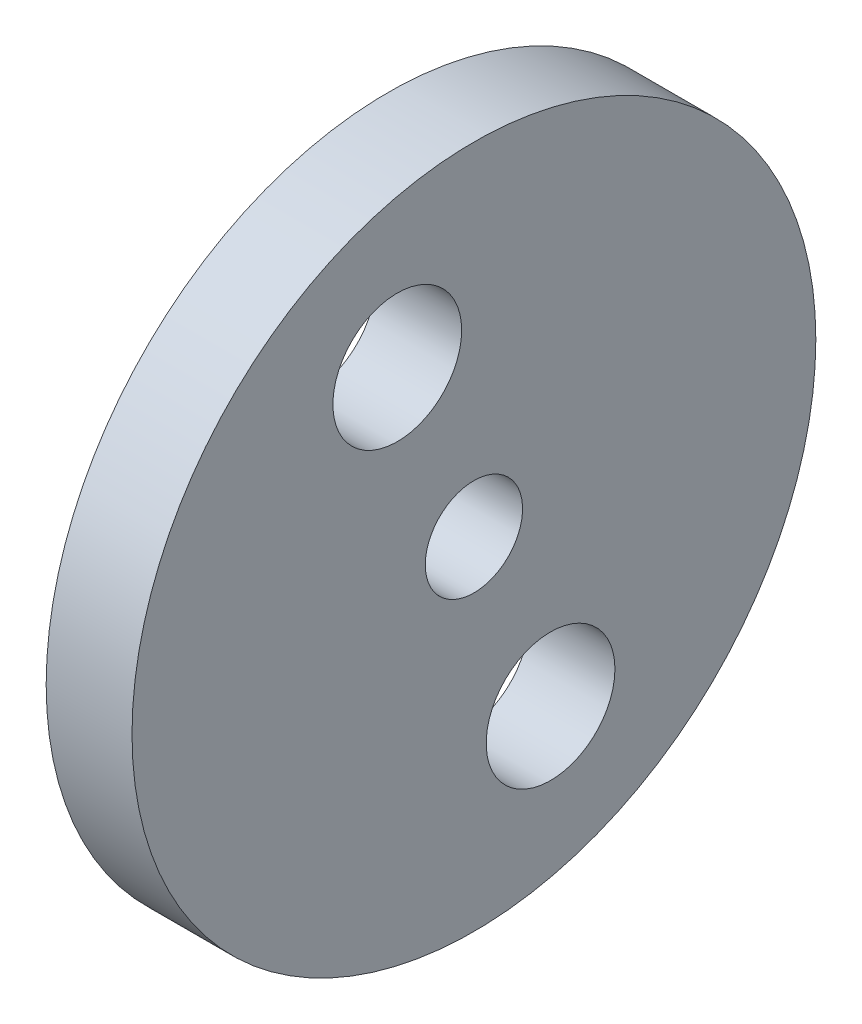
ISO-10303-21;
HEADER;
FILE_DESCRIPTION(('STEP AP214'),'2;1');
FILE_NAME('part.step','',(''),(''),'','','');
FILE_SCHEMA(('AUTOMOTIVE_DESIGN { 1 0 10303 214 1 1 1 1 }'));
ENDSEC;
DATA;
#1=APPLICATION_CONTEXT('core data for automotive mechanical design processes');
#2=APPLICATION_PROTOCOL_DEFINITION('international standard','automotive_design',2000,#1);
#3=PRODUCT_CONTEXT('',#1,'mechanical');
#4=PRODUCT('Part','Part','',(#3));
#5=PRODUCT_RELATED_PRODUCT_CATEGORY('part','',(#4));
#6=PRODUCT_DEFINITION_FORMATION('','',#4);
#7=PRODUCT_DEFINITION_CONTEXT('part definition',#1,'design');
#8=PRODUCT_DEFINITION('design','',#6,#7);
#9=PRODUCT_DEFINITION_SHAPE('','',#8);
#10=(LENGTH_UNIT() NAMED_UNIT(*) SI_UNIT(.MILLI.,.METRE.));
#11=(NAMED_UNIT(*) PLANE_ANGLE_UNIT() SI_UNIT($,.RADIAN.));
#12=(NAMED_UNIT(*) SI_UNIT($,.STERADIAN.) SOLID_ANGLE_UNIT());
#13=UNCERTAINTY_MEASURE_WITH_UNIT(LENGTH_MEASURE(1.E-05),#10,'distance_accuracy_value','');
#14=(GEOMETRIC_REPRESENTATION_CONTEXT(3) GLOBAL_UNCERTAINTY_ASSIGNED_CONTEXT((#13)) GLOBAL_UNIT_ASSIGNED_CONTEXT((#10,
#11,#12)) REPRESENTATION_CONTEXT('',''));
#15=CARTESIAN_POINT('',(0.,0.,0.));
#16=DIRECTION('',(0.,0.,1.));
#17=DIRECTION('',(1.,0.,0.));
#18=AXIS2_PLACEMENT_3D('',#15,#16,#17);
#19=CARTESIAN_POINT('',(73.,23.9,0.));
#20=DIRECTION('',(1.,0.,0.));
#21=DIRECTION('',(0.,0.,-1.));
#22=AXIS2_PLACEMENT_3D('',#19,#20,#21);
#23=PLANE('',#22);
#24=CARTESIAN_POINT('',(73.,12.934313455158,5.35756805311126));
#25=DIRECTION('',(1.,0.,0.));
#26=DIRECTION('',(0.,0.,-1.));
#27=AXIS2_PLACEMENT_3D('',#24,#25,#26);
#28=CIRCLE('',#27,4.5);
#29=CARTESIAN_POINT('',(73.,12.934313455158,0.857568053111258));
#30=VERTEX_POINT('',#29);
#31=EDGE_CURVE('E60',#30,#30,#28,.F.);
#32=ORIENTED_EDGE('',*,*,#31,.F.);
#33=EDGE_LOOP('',(#32));
#34=FACE_BOUND('',#33,.T.);
#35=CARTESIAN_POINT('',(73.,-12.934313455158,-5.35756805311126));
#36=DIRECTION('',(1.,0.,0.));
#37=DIRECTION('',(0.,0.,-1.));
#38=AXIS2_PLACEMENT_3D('',#35,#36,#37);
#39=CIRCLE('',#38,4.5);
#40=CARTESIAN_POINT('',(73.,-12.934313455158,-9.85756805311126));
#41=VERTEX_POINT('',#40);
#42=EDGE_CURVE('E64',#41,#41,#39,.F.);
#43=ORIENTED_EDGE('',*,*,#42,.F.);
#44=EDGE_LOOP('',(#43));
#45=FACE_BOUND('',#44,.T.);
#46=CARTESIAN_POINT('',(73.,0.,0.));
#47=DIRECTION('',(-1.,0.,0.));
#48=DIRECTION('',(0.,0.,1.));
#49=AXIS2_PLACEMENT_3D('',#46,#47,#48);
#50=CIRCLE('',#49,3.4);
#51=CARTESIAN_POINT('',(73.,0.,3.4));
#52=VERTEX_POINT('',#51);
#53=EDGE_CURVE('E10',#52,#52,#50,.T.);
#54=ORIENTED_EDGE('',*,*,#53,.F.);
#55=EDGE_LOOP('',(#54));
#56=FACE_BOUND('',#55,.T.);
#57=CARTESIAN_POINT('',(73.,0.,0.));
#58=DIRECTION('',(-1.,0.,0.));
#59=DIRECTION('',(0.,0.,1.));
#60=AXIS2_PLACEMENT_3D('',#57,#58,#59);
#61=CIRCLE('',#60,23.9);
#62=CARTESIAN_POINT('',(73.,0.,23.9));
#63=VERTEX_POINT('',#62);
#64=EDGE_CURVE('E54',#63,#63,#61,.T.);
#65=ORIENTED_EDGE('',*,*,#64,.T.);
#66=EDGE_LOOP('',(#65));
#67=FACE_BOUND('',#66,.T.);
#68=ADVANCED_FACE('F37',(#34,#45,#56,#67),#23,.F.);
#69=CARTESIAN_POINT('',(-110.,0.,0.));
#70=DIRECTION('',(-1.,0.,0.));
#71=DIRECTION('',(0.,0.,1.));
#72=AXIS2_PLACEMENT_3D('',#69,#70,#71);
#73=CYLINDRICAL_SURFACE('',#72,3.4);
#74=CARTESIAN_POINT('',(79.,0.,0.));
#75=DIRECTION('',(-1.,0.,0.));
#76=DIRECTION('',(0.,0.,1.));
#77=AXIS2_PLACEMENT_3D('',#74,#75,#76);
#78=CIRCLE('',#77,3.4);
#79=CARTESIAN_POINT('',(79.,0.,3.4));
#80=VERTEX_POINT('',#79);
#81=EDGE_CURVE('E44',#80,#80,#78,.T.);
#82=ORIENTED_EDGE('',*,*,#81,.F.);
#83=EDGE_LOOP('',(#82));
#84=FACE_BOUND('',#83,.T.);
#85=ORIENTED_EDGE('',*,*,#53,.T.);
#86=EDGE_LOOP('',(#85));
#87=FACE_BOUND('',#86,.T.);
#88=ADVANCED_FACE('F84',(#84,#87),#73,.F.);
#89=CARTESIAN_POINT('',(79.,3.4,0.));
#90=DIRECTION('',(-1.,0.,0.));
#91=DIRECTION('',(0.,0.,1.));
#92=AXIS2_PLACEMENT_3D('',#89,#90,#91);
#93=PLANE('',#92);
#94=CARTESIAN_POINT('',(79.,12.934313455158,5.35756805311126));
#95=DIRECTION('',(1.,0.,0.));
#96=DIRECTION('',(0.,0.,-1.));
#97=AXIS2_PLACEMENT_3D('',#94,#95,#96);
#98=CIRCLE('',#97,4.5);
#99=CARTESIAN_POINT('',(79.,12.934313455158,0.857568053111258));
#100=VERTEX_POINT('',#99);
#101=EDGE_CURVE('E68',#100,#100,#98,.T.);
#102=ORIENTED_EDGE('',*,*,#101,.F.);
#103=EDGE_LOOP('',(#102));
#104=FACE_BOUND('',#103,.T.);
#105=CARTESIAN_POINT('',(79.,-12.934313455158,-5.35756805311126));
#106=DIRECTION('',(1.,0.,0.));
#107=DIRECTION('',(0.,0.,-1.));
#108=AXIS2_PLACEMENT_3D('',#105,#106,#107);
#109=CIRCLE('',#108,4.5);
#110=CARTESIAN_POINT('',(79.,-12.934313455158,-9.85756805311126));
#111=VERTEX_POINT('',#110);
#112=EDGE_CURVE('E69',#111,#111,#109,.T.);
#113=ORIENTED_EDGE('',*,*,#112,.F.);
#114=EDGE_LOOP('',(#113));
#115=FACE_BOUND('',#114,.T.);
#116=CARTESIAN_POINT('',(79.,0.,0.));
#117=DIRECTION('',(-1.,0.,0.));
#118=DIRECTION('',(0.,0.,1.));
#119=AXIS2_PLACEMENT_3D('',#116,#117,#118);
#120=CIRCLE('',#119,23.9);
#121=CARTESIAN_POINT('',(79.,0.,23.9));
#122=VERTEX_POINT('',#121);
#123=EDGE_CURVE('E49',#122,#122,#120,.T.);
#124=ORIENTED_EDGE('',*,*,#123,.F.);
#125=EDGE_LOOP('',(#124));
#126=FACE_BOUND('',#125,.T.);
#127=ORIENTED_EDGE('',*,*,#81,.T.);
#128=EDGE_LOOP('',(#127));
#129=FACE_BOUND('',#128,.T.);
#130=ADVANCED_FACE('F80',(#104,#115,#126,#129),#93,.F.);
#131=CARTESIAN_POINT('',(-110.,0.,0.));
#132=DIRECTION('',(-1.,0.,0.));
#133=DIRECTION('',(0.,0.,1.));
#134=AXIS2_PLACEMENT_3D('',#131,#132,#133);
#135=CYLINDRICAL_SURFACE('',#134,23.9);
#136=ORIENTED_EDGE('',*,*,#64,.F.);
#137=EDGE_LOOP('',(#136));
#138=FACE_BOUND('',#137,.T.);
#139=ORIENTED_EDGE('',*,*,#123,.T.);
#140=EDGE_LOOP('',(#139));
#141=FACE_BOUND('',#140,.T.);
#142=ADVANCED_FACE('F83',(#138,#141),#135,.T.);
#143=CARTESIAN_POINT('',(73.,-12.934313455158,-5.35756805311126));
#144=DIRECTION('',(-1.,0.,0.));
#145=DIRECTION('',(0.,0.,1.));
#146=AXIS2_PLACEMENT_3D('',#143,#144,#145);
#147=CYLINDRICAL_SURFACE('',#146,4.5);
#148=ORIENTED_EDGE('',*,*,#112,.T.);
#149=EDGE_LOOP('',(#148));
#150=FACE_BOUND('',#149,.T.);
#151=ORIENTED_EDGE('',*,*,#42,.T.);
#152=EDGE_LOOP('',(#151));
#153=FACE_BOUND('',#152,.T.);
#154=ADVANCED_FACE('F91',(#150,#153),#147,.F.);
#155=CARTESIAN_POINT('',(73.,12.934313455158,5.35756805311126));
#156=DIRECTION('',(-1.,0.,0.));
#157=DIRECTION('',(0.,0.,1.));
#158=AXIS2_PLACEMENT_3D('',#155,#156,#157);
#159=CYLINDRICAL_SURFACE('',#158,4.5);
#160=ORIENTED_EDGE('',*,*,#101,.T.);
#161=EDGE_LOOP('',(#160));
#162=FACE_BOUND('',#161,.T.);
#163=ORIENTED_EDGE('',*,*,#31,.T.);
#164=EDGE_LOOP('',(#163));
#165=FACE_BOUND('',#164,.T.);
#166=ADVANCED_FACE('F77',(#162,#165),#159,.F.);
#167=CLOSED_SHELL('',(#68,#88,#130,#142,#154,#166));
#168=MANIFOLD_SOLID_BREP('B2',#167);
#169=ADVANCED_BREP_SHAPE_REPRESENTATION('',(#18,#168),#14);
#170=SHAPE_DEFINITION_REPRESENTATION(#9,#169);
ENDSEC;
END-ISO-10303-21;
